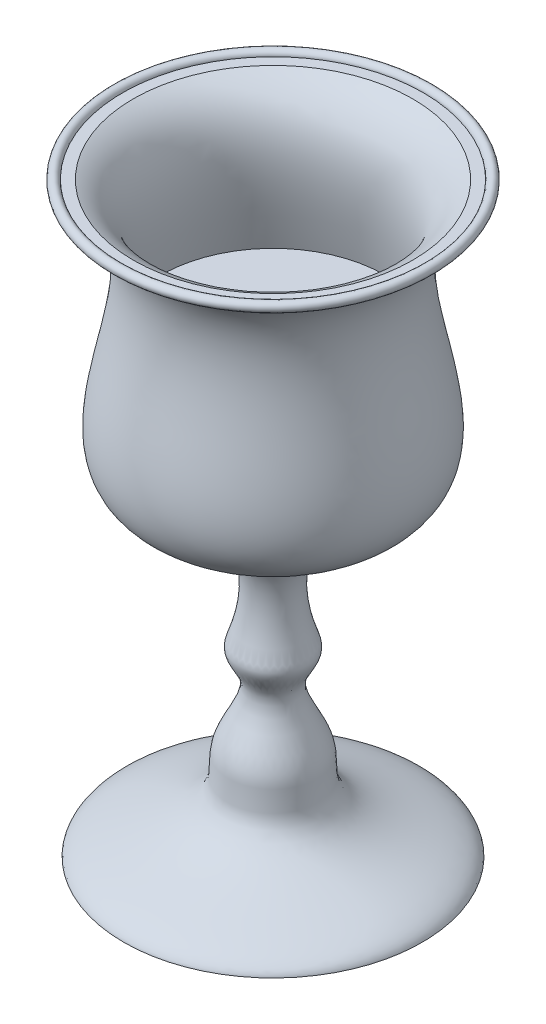
ISO-10303-21;
HEADER;
FILE_DESCRIPTION(('STEP AP214'),'2;1');
FILE_NAME('part.step','',(''),(''),'','','');
FILE_SCHEMA(('AUTOMOTIVE_DESIGN { 1 0 10303 214 1 1 1 1 }'));
ENDSEC;
DATA;
#1=APPLICATION_CONTEXT('core data for automotive mechanical design processes');
#2=APPLICATION_PROTOCOL_DEFINITION('international standard','automotive_design',2000,#1);
#3=PRODUCT_CONTEXT('',#1,'mechanical');
#4=PRODUCT('Part','Part','',(#3));
#5=PRODUCT_RELATED_PRODUCT_CATEGORY('part','',(#4));
#6=PRODUCT_DEFINITION_FORMATION('','',#4);
#7=PRODUCT_DEFINITION_CONTEXT('part definition',#1,'design');
#8=PRODUCT_DEFINITION('design','',#6,#7);
#9=PRODUCT_DEFINITION_SHAPE('','',#8);
#10=(LENGTH_UNIT() NAMED_UNIT(*) SI_UNIT(.MILLI.,.METRE.));
#11=(NAMED_UNIT(*) PLANE_ANGLE_UNIT() SI_UNIT($,.RADIAN.));
#12=(NAMED_UNIT(*) SI_UNIT($,.STERADIAN.) SOLID_ANGLE_UNIT());
#13=UNCERTAINTY_MEASURE_WITH_UNIT(LENGTH_MEASURE(1.E-05),#10,'distance_accuracy_value','');
#14=(GEOMETRIC_REPRESENTATION_CONTEXT(3) GLOBAL_UNCERTAINTY_ASSIGNED_CONTEXT((#13)) GLOBAL_UNIT_ASSIGNED_CONTEXT((#10,
#11,#12)) REPRESENTATION_CONTEXT('',''));
#15=CARTESIAN_POINT('',(0.,0.,0.));
#16=DIRECTION('',(0.,0.,1.));
#17=DIRECTION('',(1.,0.,0.));
#18=AXIS2_PLACEMENT_3D('',#15,#16,#17);
#19=CARTESIAN_POINT('',(0.,80.5012387841994,0.));
#20=CARTESIAN_POINT('',(20.7095937907324,84.6623569501836,0.));
#21=CARTESIAN_POINT('',(37.2983100214334,90.8390422753648,0.));
#22=CARTESIAN_POINT('',(32.9895444654272,111.741335174457,0.));
#23=CARTESIAN_POINT('',(30.8203486290976,122.672950951185,0.));
#24=B_SPLINE_CURVE_WITH_KNOTS('',3,(#19,#20,#21,#22,#23),.UNSPECIFIED.,.F.,.F.,(4,1,4),
(0.00686179358743333,0.287216708958834,0.58027235457988),.UNSPECIFIED.);
#25=CARTESIAN_POINT('',(0.,80.5012387841994,0.));
#26=DIRECTION('',(0.,-1.,0.));
#27=AXIS1_PLACEMENT('',#25,#26);
#28=SURFACE_OF_REVOLUTION('',#24,#27);
#29=CARTESIAN_POINT('',(0.,122.672950951185,0.));
#30=DIRECTION('',(0.,-1.,0.));
#31=DIRECTION('',(0.,0.,-1.));
#32=AXIS2_PLACEMENT_3D('',#29,#30,#31);
#33=CIRCLE('',#32,30.8203486290976);
#34=CARTESIAN_POINT('',(0.,122.672950951185,-30.8203486290976));
#35=VERTEX_POINT('',#34);
#36=EDGE_CURVE('E12',#35,#35,#33,.T.);
#37=ORIENTED_EDGE('',*,*,#36,.T.);
#38=EDGE_LOOP('',(#37));
#39=FACE_BOUND('',#38,.T.);
#40=CARTESIAN_POINT('',(0.,80.5012387841994,0.));
#41=VERTEX_POINT('',#40);
#42=VERTEX_LOOP('',#41);
#43=FACE_BOUND('',#42,.T.);
#44=ADVANCED_FACE('F43',(#39,#43),#28,.F.);
#45=CARTESIAN_POINT('',(0.,122.672950951185,0.));
#46=DIRECTION('',(0.,1.,0.));
#47=DIRECTION('',(0.,0.,1.));
#48=AXIS2_PLACEMENT_3D('',#45,#46,#47);
#49=PLANE('',#48);
#50=ORIENTED_EDGE('',*,*,#36,.F.);
#51=EDGE_LOOP('',(#50));
#52=FACE_BOUND('',#51,.T.);
#53=ADVANCED_FACE('F52',(#52),#49,.T.);
#54=CLOSED_SHELL('',(#44,#53));
#55=MANIFOLD_SOLID_BREP('B2',#54);
#56=CARTESIAN_POINT('',(38.3490938220569,160.82593111159,0.));
#57=CARTESIAN_POINT('',(16.4899101433223,150.451024937271,0.));
#58=CARTESIAN_POINT('',(48.7680670193127,95.2005436604656,0.));
#59=CARTESIAN_POINT('',(21.8881215735966,84.7360182474236,0.));
#60=CARTESIAN_POINT('',(0.,80.4129655557951,0.));
#61=B_SPLINE_CURVE_WITH_KNOTS('',3,(#56,#57,#58,#59,#60),.UNSPECIFIED.,.F.,.F.,(4,1,4),(0.,
0.712783291041166,1.),.UNSPECIFIED.);
#62=CARTESIAN_POINT('',(0.,0.,0.));
#63=DIRECTION('',(0.,-1.,0.));
#64=AXIS1_PLACEMENT('',#62,#63);
#65=SURFACE_OF_REVOLUTION('',#61,#64);
#66=CARTESIAN_POINT('',(0.,80.4129655557951,0.));
#67=VERTEX_POINT('',#66);
#68=VERTEX_LOOP('',#67);
#69=FACE_BOUND('',#68,.T.);
#70=CARTESIAN_POINT('',(0.,160.82593111159,0.));
#71=DIRECTION('',(0.,-1.,0.));
#72=DIRECTION('',(0.,0.,-1.));
#73=AXIS2_PLACEMENT_3D('',#70,#71,#72);
#74=CIRCLE('',#73,38.3490938220569);
#75=CARTESIAN_POINT('',(0.,160.82593111159,-38.3490938220569));
#76=VERTEX_POINT('',#75);
#77=EDGE_CURVE('E94',#76,#76,#74,.T.);
#78=ORIENTED_EDGE('',*,*,#77,.F.);
#79=EDGE_LOOP('',(#78));
#80=FACE_BOUND('',#79,.T.);
#81=ADVANCED_FACE('F78',(#69,#80),#65,.F.);
#82=CARTESIAN_POINT('',(38.3490938220569,160.82593111159,0.));
#83=DIRECTION('',(0.,1.,0.));
#84=DIRECTION('',(0.,0.,1.));
#85=AXIS2_PLACEMENT_3D('',#82,#83,#84);
#86=PLANE('',#85);
#87=CARTESIAN_POINT('',(0.,160.82593111159,0.));
#88=DIRECTION('',(0.,-1.,0.));
#89=DIRECTION('',(0.,0.,-1.));
#90=AXIS2_PLACEMENT_3D('',#87,#88,#89);
#91=CIRCLE('',#90,41.256312859022);
#92=CARTESIAN_POINT('',(0.,160.82593111159,-41.256312859022));
#93=VERTEX_POINT('',#92);
#94=EDGE_CURVE('E41',#93,#93,#91,.T.);
#95=ORIENTED_EDGE('',*,*,#94,.F.);
#96=EDGE_LOOP('',(#95));
#97=FACE_BOUND('',#96,.T.);
#98=ORIENTED_EDGE('',*,*,#77,.T.);
#99=EDGE_LOOP('',(#98));
#100=FACE_BOUND('',#99,.T.);
#101=ADVANCED_FACE('F91',(#97,#100),#86,.T.);
#102=CARTESIAN_POINT('',(0.,160.82593111159,0.));
#103=DIRECTION('',(0.,-1.,0.));
#104=DIRECTION('',(0.,0.,-1.));
#105=AXIS2_PLACEMENT_3D('',#102,#103,#104);
#106=TOROIDAL_SURFACE('',#105,42.5820830512535,1.3257701922315);
#107=ORIENTED_EDGE('',*,*,#94,.T.);
#108=EDGE_LOOP('',(#107));
#109=FACE_BOUND('',#108,.T.);
#110=CARTESIAN_POINT('',(0.,160.144690915984,0.));
#111=DIRECTION('',(0.,-1.,0.));
#112=DIRECTION('',(0.,0.,-1.));
#113=AXIS2_PLACEMENT_3D('',#110,#111,#112);
#114=CIRCLE('',#113,41.4447271709329);
#115=CARTESIAN_POINT('',(0.,160.144690915984,-41.4447271709329));
#116=VERTEX_POINT('',#115);
#117=EDGE_CURVE('E82',#116,#116,#114,.F.);
#118=ORIENTED_EDGE('',*,*,#117,.T.);
#119=EDGE_LOOP('',(#118));
#120=FACE_BOUND('',#119,.T.);
#121=ADVANCED_FACE('F121',(#109,#120),#106,.T.);
#122=CARTESIAN_POINT('',(0.,0.,0.));
#123=DIRECTION('',(0.,-1.,0.));
#124=DIRECTION('',(0.,0.,-1.));
#125=AXIS2_PLACEMENT_3D('',#122,#123,#124);
#126=PLANE('',#125);
#127=CARTESIAN_POINT('',(0.,0.,0.));
#128=DIRECTION('',(0.,-1.,0.));
#129=DIRECTION('',(0.,0.,-1.));
#130=AXIS2_PLACEMENT_3D('',#127,#128,#129);
#131=CIRCLE('',#130,40.9402433254964);
#132=CARTESIAN_POINT('',(0.,0.,-40.9402433254964));
#133=VERTEX_POINT('',#132);
#134=EDGE_CURVE('E96',#133,#133,#131,.T.);
#135=ORIENTED_EDGE('',*,*,#134,.T.);
#136=EDGE_LOOP('',(#135));
#137=FACE_BOUND('',#136,.T.);
#138=ADVANCED_FACE('F117',(#137),#126,.T.);
#139=CARTESIAN_POINT('',(40.9402433254964,0.,0.));
#140=CARTESIAN_POINT('',(39.5919713842452,5.60400603164953,0.));
#141=CARTESIAN_POINT('',(9.92096387305916,8.0973793694739,0.));
#142=CARTESIAN_POINT('',(13.7218205568292,29.4917747506888,0.));
#143=CARTESIAN_POINT('',(3.34365987180082,39.3389461323281,0.));
#144=CARTESIAN_POINT('',(8.50708182812228,46.5325163142412,0.));
#145=CARTESIAN_POINT('',(9.83757463440027,49.7646893607262,0.));
#146=CARTESIAN_POINT('',(6.32571463410283,58.8497947456285,0.));
#147=CARTESIAN_POINT('',(4.01311980340412,80.5496480535794,0.));
#148=CARTESIAN_POINT('',(60.1534022780393,89.1817973301086,0.));
#149=CARTESIAN_POINT('',(15.587631196811,145.540583150277,0.));
#150=CARTESIAN_POINT('',(42.5820830512535,160.82593111159,0.));
#151=B_SPLINE_CURVE_WITH_KNOTS('',3,(#139,#140,#141,#142,#143,#144,#145,#146,#147,#148,#149,
#150),.UNSPECIFIED.,.F.,.F.,(4,1,1,1,1,1,1,1,1,4),(0.,0.173163405828977,0.216359067541322,
0.311104435425098,0.331402796572626,0.347582859798631,0.362383879291905,0.478386763538566,
0.619445941170089,1.),.UNSPECIFIED.);
#152=CARTESIAN_POINT('',(0.,0.,0.));
#153=DIRECTION('',(0.,-1.,0.));
#154=AXIS1_PLACEMENT('',#152,#153);
#155=SURFACE_OF_REVOLUTION('',#151,#154);
#156=ORIENTED_EDGE('',*,*,#117,.F.);
#157=EDGE_LOOP('',(#156));
#158=FACE_BOUND('',#157,.T.);
#159=ORIENTED_EDGE('',*,*,#134,.F.);
#160=EDGE_LOOP('',(#159));
#161=FACE_BOUND('',#160,.T.);
#162=ADVANCED_FACE('F114',(#158,#161),#155,.F.);
#163=CLOSED_SHELL('',(#81,#101,#121,#138,#162));
#164=MANIFOLD_SOLID_BREP('B6',#163);
#165=ADVANCED_BREP_SHAPE_REPRESENTATION('',(#18,#55,#164),#14);
#166=SHAPE_DEFINITION_REPRESENTATION(#9,#165);
ENDSEC;
END-ISO-10303-21;
